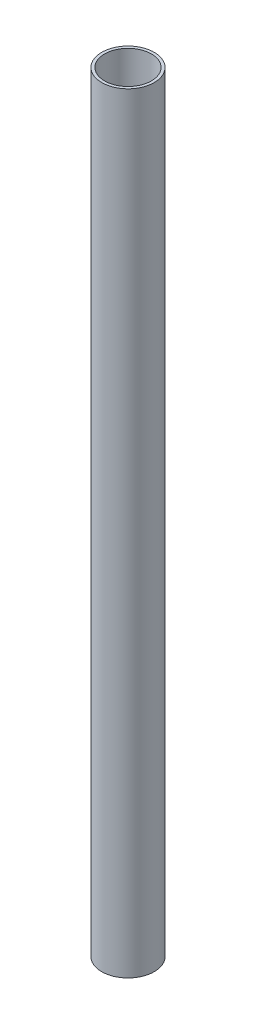
ISO-10303-21;
HEADER;
FILE_DESCRIPTION(('STEP AP214'),'2;1');
FILE_NAME('part.step','',(''),(''),'','','');
FILE_SCHEMA(('AUTOMOTIVE_DESIGN { 1 0 10303 214 1 1 1 1 }'));
ENDSEC;
DATA;
#1=APPLICATION_CONTEXT('core data for automotive mechanical design processes');
#2=APPLICATION_PROTOCOL_DEFINITION('international standard','automotive_design',2000,#1);
#3=PRODUCT_CONTEXT('',#1,'mechanical');
#4=PRODUCT('Part','Part','',(#3));
#5=PRODUCT_RELATED_PRODUCT_CATEGORY('part','',(#4));
#6=PRODUCT_DEFINITION_FORMATION('','',#4);
#7=PRODUCT_DEFINITION_CONTEXT('part definition',#1,'design');
#8=PRODUCT_DEFINITION('design','',#6,#7);
#9=PRODUCT_DEFINITION_SHAPE('','',#8);
#10=(LENGTH_UNIT() NAMED_UNIT(*) SI_UNIT(.MILLI.,.METRE.));
#11=(NAMED_UNIT(*) PLANE_ANGLE_UNIT() SI_UNIT($,.RADIAN.));
#12=(NAMED_UNIT(*) SI_UNIT($,.STERADIAN.) SOLID_ANGLE_UNIT());
#13=UNCERTAINTY_MEASURE_WITH_UNIT(LENGTH_MEASURE(1.E-05),#10,'distance_accuracy_value','');
#14=(GEOMETRIC_REPRESENTATION_CONTEXT(3) GLOBAL_UNCERTAINTY_ASSIGNED_CONTEXT((#13)) GLOBAL_UNIT_ASSIGNED_CONTEXT((#10,
#11,#12)) REPRESENTATION_CONTEXT('',''));
#15=CARTESIAN_POINT('',(0.,0.,0.));
#16=DIRECTION('',(0.,0.,1.));
#17=DIRECTION('',(1.,0.,0.));
#18=AXIS2_PLACEMENT_3D('',#15,#16,#17);
#19=CARTESIAN_POINT('',(0.,1099.999999894,0.));
#20=DIRECTION('',(0.,1.,0.));
#21=DIRECTION('',(0.,0.,1.));
#22=AXIS2_PLACEMENT_3D('',#19,#20,#21);
#23=PLANE('',#22);
#24=CARTESIAN_POINT('',(0.,1099.999999894,0.));
#25=DIRECTION('',(0.,1.,0.));
#26=DIRECTION('',(0.,0.,1.));
#27=AXIS2_PLACEMENT_3D('',#24,#25,#26);
#28=CIRCLE('',#27,37.465);
#29=CARTESIAN_POINT('',(0.,1099.999999894,37.465));
#30=VERTEX_POINT('',#29);
#31=EDGE_CURVE('E10',#30,#30,#28,.T.);
#32=ORIENTED_EDGE('',*,*,#31,.T.);
#33=EDGE_LOOP('',(#32));
#34=FACE_BOUND('',#33,.T.);
#35=CARTESIAN_POINT('',(0.,1099.999999894,0.));
#36=DIRECTION('',(0.,1.,0.));
#37=DIRECTION('',(0.,0.,1.));
#38=AXIS2_PLACEMENT_3D('',#35,#36,#37);
#39=CIRCLE('',#38,33.465008);
#40=CARTESIAN_POINT('',(0.,1099.999999894,33.465008));
#41=VERTEX_POINT('',#40);
#42=EDGE_CURVE('E45',#41,#41,#39,.T.);
#43=ORIENTED_EDGE('',*,*,#42,.F.);
#44=EDGE_LOOP('',(#43));
#45=FACE_BOUND('',#44,.T.);
#46=ADVANCED_FACE('F34',(#34,#45),#23,.T.);
#47=CARTESIAN_POINT('',(0.,0.,0.));
#48=DIRECTION('',(0.,1.,0.));
#49=DIRECTION('',(0.,0.,1.));
#50=AXIS2_PLACEMENT_3D('',#47,#48,#49);
#51=PLANE('',#50);
#52=CARTESIAN_POINT('',(0.,0.,0.));
#53=DIRECTION('',(0.,1.,0.));
#54=DIRECTION('',(0.,0.,1.));
#55=AXIS2_PLACEMENT_3D('',#52,#53,#54);
#56=CIRCLE('',#55,37.465);
#57=CARTESIAN_POINT('',(0.,0.,37.465));
#58=VERTEX_POINT('',#57);
#59=EDGE_CURVE('E38',#58,#58,#56,.T.);
#60=ORIENTED_EDGE('',*,*,#59,.F.);
#61=EDGE_LOOP('',(#60));
#62=FACE_BOUND('',#61,.T.);
#63=CARTESIAN_POINT('',(0.,0.,0.));
#64=DIRECTION('',(0.,1.,0.));
#65=DIRECTION('',(0.,0.,1.));
#66=AXIS2_PLACEMENT_3D('',#63,#64,#65);
#67=CIRCLE('',#66,33.465008);
#68=CARTESIAN_POINT('',(0.,0.,33.465008));
#69=VERTEX_POINT('',#68);
#70=EDGE_CURVE('E47',#69,#69,#67,.T.);
#71=ORIENTED_EDGE('',*,*,#70,.T.);
#72=EDGE_LOOP('',(#71));
#73=FACE_BOUND('',#72,.T.);
#74=ADVANCED_FACE('F57',(#62,#73),#51,.F.);
#75=CARTESIAN_POINT('',(0.,1099.999999894,0.));
#76=DIRECTION('',(0.,-1.,0.));
#77=DIRECTION('',(0.,0.,-1.));
#78=AXIS2_PLACEMENT_3D('',#75,#76,#77);
#79=CYLINDRICAL_SURFACE('',#78,37.465);
#80=ORIENTED_EDGE('',*,*,#31,.F.);
#81=EDGE_LOOP('',(#80));
#82=FACE_BOUND('',#81,.T.);
#83=ORIENTED_EDGE('',*,*,#59,.T.);
#84=EDGE_LOOP('',(#83));
#85=FACE_BOUND('',#84,.T.);
#86=ADVANCED_FACE('F36',(#82,#85),#79,.T.);
#87=CARTESIAN_POINT('',(0.,1099.999999894,0.));
#88=DIRECTION('',(0.,-1.,0.));
#89=DIRECTION('',(0.,0.,-1.));
#90=AXIS2_PLACEMENT_3D('',#87,#88,#89);
#91=CYLINDRICAL_SURFACE('',#90,33.465008);
#92=ORIENTED_EDGE('',*,*,#42,.T.);
#93=EDGE_LOOP('',(#92));
#94=FACE_BOUND('',#93,.T.);
#95=ORIENTED_EDGE('',*,*,#70,.F.);
#96=EDGE_LOOP('',(#95));
#97=FACE_BOUND('',#96,.T.);
#98=ADVANCED_FACE('F53',(#94,#97),#91,.F.);
#99=CLOSED_SHELL('',(#46,#74,#86,#98));
#100=MANIFOLD_SOLID_BREP('B2',#99);
#101=ADVANCED_BREP_SHAPE_REPRESENTATION('',(#18,#100),#14);
#102=SHAPE_DEFINITION_REPRESENTATION(#9,#101);
ENDSEC;
END-ISO-10303-21;
